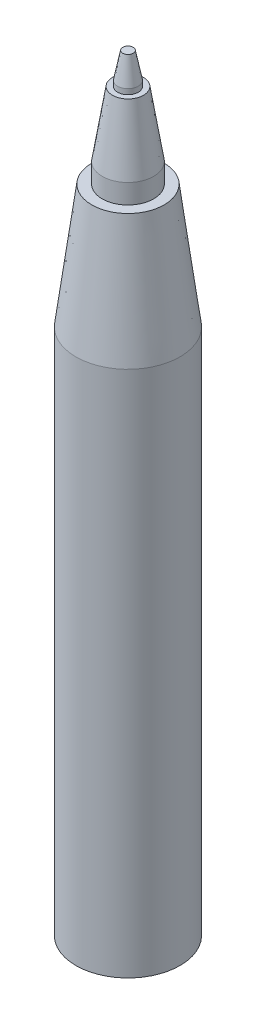
ISO-10303-21;
HEADER;
FILE_DESCRIPTION(('STEP AP214'),'2;1');
FILE_NAME('part.step','',(''),(''),'','','');
FILE_SCHEMA(('AUTOMOTIVE_DESIGN { 1 0 10303 214 1 1 1 1 }'));
ENDSEC;
DATA;
#1=APPLICATION_CONTEXT('core data for automotive mechanical design processes');
#2=APPLICATION_PROTOCOL_DEFINITION('international standard','automotive_design',2000,#1);
#3=PRODUCT_CONTEXT('',#1,'mechanical');
#4=PRODUCT('Part','Part','',(#3));
#5=PRODUCT_RELATED_PRODUCT_CATEGORY('part','',(#4));
#6=PRODUCT_DEFINITION_FORMATION('','',#4);
#7=PRODUCT_DEFINITION_CONTEXT('part definition',#1,'design');
#8=PRODUCT_DEFINITION('design','',#6,#7);
#9=PRODUCT_DEFINITION_SHAPE('','',#8);
#10=(LENGTH_UNIT() NAMED_UNIT(*) SI_UNIT(.MILLI.,.METRE.));
#11=(NAMED_UNIT(*) PLANE_ANGLE_UNIT() SI_UNIT($,.RADIAN.));
#12=(NAMED_UNIT(*) SI_UNIT($,.STERADIAN.) SOLID_ANGLE_UNIT());
#13=UNCERTAINTY_MEASURE_WITH_UNIT(LENGTH_MEASURE(1.E-05),#10,'distance_accuracy_value','');
#14=(GEOMETRIC_REPRESENTATION_CONTEXT(3) GLOBAL_UNCERTAINTY_ASSIGNED_CONTEXT((#13)) GLOBAL_UNIT_ASSIGNED_CONTEXT((#10,
#11,#12)) REPRESENTATION_CONTEXT('',''));
#15=CARTESIAN_POINT('',(0.,0.,0.));
#16=DIRECTION('',(0.,0.,1.));
#17=DIRECTION('',(1.,0.,0.));
#18=AXIS2_PLACEMENT_3D('',#15,#16,#17);
#19=CARTESIAN_POINT('',(0.,0.,0.));
#20=DIRECTION('',(0.,1.,0.));
#21=DIRECTION('',(0.,0.,1.));
#22=AXIS2_PLACEMENT_3D('',#19,#20,#21);
#23=PLANE('',#22);
#24=CARTESIAN_POINT('',(0.,0.,0.));
#25=DIRECTION('',(0.,1.,0.));
#26=DIRECTION('',(0.,0.,1.));
#27=AXIS2_PLACEMENT_3D('',#24,#25,#26);
#28=CIRCLE('',#27,4.);
#29=CARTESIAN_POINT('',(0.,0.,4.));
#30=VERTEX_POINT('',#29);
#31=EDGE_CURVE('E10',#30,#30,#28,.T.);
#32=ORIENTED_EDGE('',*,*,#31,.F.);
#33=EDGE_LOOP('',(#32));
#34=FACE_BOUND('',#33,.T.);
#35=ADVANCED_FACE('F34',(#34),#23,.F.);
#36=CARTESIAN_POINT('',(0.,0.839345578277775,0.));
#37=DIRECTION('',(0.,1.,0.));
#38=DIRECTION('',(0.,0.,1.));
#39=AXIS2_PLACEMENT_3D('',#36,#37,#38);
#40=CYLINDRICAL_SURFACE('',#39,4.);
#41=CARTESIAN_POINT('',(0.,40.5,0.));
#42=DIRECTION('',(0.,1.,0.));
#43=DIRECTION('',(0.,0.,1.));
#44=AXIS2_PLACEMENT_3D('',#41,#42,#43);
#45=CIRCLE('',#44,4.);
#46=CARTESIAN_POINT('',(0.,40.5,4.));
#47=VERTEX_POINT('',#46);
#48=EDGE_CURVE('E40',#47,#47,#45,.T.);
#49=ORIENTED_EDGE('',*,*,#48,.F.);
#50=EDGE_LOOP('',(#49));
#51=FACE_BOUND('',#50,.T.);
#52=ORIENTED_EDGE('',*,*,#31,.T.);
#53=EDGE_LOOP('',(#52));
#54=FACE_BOUND('',#53,.T.);
#55=ADVANCED_FACE('F109',(#51,#54),#40,.T.);
#56=CARTESIAN_POINT('',(0.,40.5,0.));
#57=DIRECTION('',(0.,-1.,0.));
#58=DIRECTION('',(0.,0.,-1.));
#59=AXIS2_PLACEMENT_3D('',#56,#57,#58);
#60=CONICAL_SURFACE('',#59,4.,0.12791614658432);
#61=CARTESIAN_POINT('',(0.,50.,0.));
#62=DIRECTION('',(0.,1.,0.));
#63=DIRECTION('',(0.,0.,1.));
#64=AXIS2_PLACEMENT_3D('',#61,#62,#63);
#65=CIRCLE('',#64,2.77812499999999);
#66=CARTESIAN_POINT('',(0.,50.,2.77812499999999));
#67=VERTEX_POINT('',#66);
#68=EDGE_CURVE('E44',#67,#67,#65,.T.);
#69=ORIENTED_EDGE('',*,*,#68,.F.);
#70=EDGE_LOOP('',(#69));
#71=FACE_BOUND('',#70,.T.);
#72=ORIENTED_EDGE('',*,*,#48,.T.);
#73=EDGE_LOOP('',(#72));
#74=FACE_BOUND('',#73,.T.);
#75=ADVANCED_FACE('F104',(#71,#74),#60,.T.);
#76=CARTESIAN_POINT('',(2.77812499999999,50.,0.));
#77=DIRECTION('',(0.,-1.,0.));
#78=DIRECTION('',(0.,0.,-1.));
#79=AXIS2_PLACEMENT_3D('',#76,#77,#78);
#80=PLANE('',#79);
#81=CARTESIAN_POINT('',(0.,50.,0.));
#82=DIRECTION('',(0.,1.,0.));
#83=DIRECTION('',(0.,0.,1.));
#84=AXIS2_PLACEMENT_3D('',#81,#82,#83);
#85=CIRCLE('',#84,1.97812499999999);
#86=CARTESIAN_POINT('',(0.,50.,1.97812499999999));
#87=VERTEX_POINT('',#86);
#88=EDGE_CURVE('E48',#87,#87,#85,.T.);
#89=ORIENTED_EDGE('',*,*,#88,.F.);
#90=EDGE_LOOP('',(#89));
#91=FACE_BOUND('',#90,.T.);
#92=ORIENTED_EDGE('',*,*,#68,.T.);
#93=EDGE_LOOP('',(#92));
#94=FACE_BOUND('',#93,.T.);
#95=ADVANCED_FACE('F98',(#91,#94),#80,.F.);
#96=CARTESIAN_POINT('',(0.,0.839345578277775,0.));
#97=DIRECTION('',(0.,1.,0.));
#98=DIRECTION('',(0.,0.,1.));
#99=AXIS2_PLACEMENT_3D('',#96,#97,#98);
#100=CYLINDRICAL_SURFACE('',#99,1.97812499999999);
#101=CARTESIAN_POINT('',(0.,51.5,0.));
#102=DIRECTION('',(0.,1.,0.));
#103=DIRECTION('',(0.,0.,1.));
#104=AXIS2_PLACEMENT_3D('',#101,#102,#103);
#105=CIRCLE('',#104,1.97812499999999);
#106=CARTESIAN_POINT('',(0.,51.5,1.97812499999999));
#107=VERTEX_POINT('',#106);
#108=EDGE_CURVE('E53',#107,#107,#105,.T.);
#109=ORIENTED_EDGE('',*,*,#108,.F.);
#110=EDGE_LOOP('',(#109));
#111=FACE_BOUND('',#110,.T.);
#112=ORIENTED_EDGE('',*,*,#88,.T.);
#113=EDGE_LOOP('',(#112));
#114=FACE_BOUND('',#113,.T.);
#115=ADVANCED_FACE('F92',(#111,#114),#100,.T.);
#116=CARTESIAN_POINT('',(0.,51.5,0.));
#117=DIRECTION('',(0.,-1.,0.));
#118=DIRECTION('',(0.,0.,-1.));
#119=AXIS2_PLACEMENT_3D('',#116,#117,#118);
#120=CONICAL_SURFACE('',#119,1.97812499999999,0.156216718444122);
#121=CARTESIAN_POINT('',(0.,56.5,0.));
#122=DIRECTION('',(0.,1.,0.));
#123=DIRECTION('',(0.,0.,1.));
#124=AXIS2_PLACEMENT_3D('',#121,#122,#123);
#125=CIRCLE('',#124,1.19062499999999);
#126=CARTESIAN_POINT('',(0.,56.5,1.19062499999999));
#127=VERTEX_POINT('',#126);
#128=EDGE_CURVE('E56',#127,#127,#125,.T.);
#129=ORIENTED_EDGE('',*,*,#128,.F.);
#130=EDGE_LOOP('',(#129));
#131=FACE_BOUND('',#130,.T.);
#132=ORIENTED_EDGE('',*,*,#108,.T.);
#133=EDGE_LOOP('',(#132));
#134=FACE_BOUND('',#133,.T.);
#135=ADVANCED_FACE('F86',(#131,#134),#120,.T.);
#136=CARTESIAN_POINT('',(1.19062499999999,56.5,0.));
#137=DIRECTION('',(0.,-1.,0.));
#138=DIRECTION('',(0.,0.,-1.));
#139=AXIS2_PLACEMENT_3D('',#136,#137,#138);
#140=PLANE('',#139);
#141=CARTESIAN_POINT('',(0.,56.5,0.));
#142=DIRECTION('',(0.,1.,0.));
#143=DIRECTION('',(0.,0.,1.));
#144=AXIS2_PLACEMENT_3D('',#141,#142,#143);
#145=CIRCLE('',#144,0.790624999999993);
#146=CARTESIAN_POINT('',(0.,56.5,0.790624999999993));
#147=VERTEX_POINT('',#146);
#148=EDGE_CURVE('E59',#147,#147,#145,.T.);
#149=ORIENTED_EDGE('',*,*,#148,.F.);
#150=EDGE_LOOP('',(#149));
#151=FACE_BOUND('',#150,.T.);
#152=ORIENTED_EDGE('',*,*,#128,.T.);
#153=EDGE_LOOP('',(#152));
#154=FACE_BOUND('',#153,.T.);
#155=ADVANCED_FACE('F80',(#151,#154),#140,.F.);
#156=CARTESIAN_POINT('',(0.,0.839345578277775,0.));
#157=DIRECTION('',(0.,1.,0.));
#158=DIRECTION('',(0.,0.,1.));
#159=AXIS2_PLACEMENT_3D('',#156,#157,#158);
#160=CYLINDRICAL_SURFACE('',#159,0.790624999999993);
#161=CARTESIAN_POINT('',(0.,56.9,0.));
#162=DIRECTION('',(0.,1.,0.));
#163=DIRECTION('',(0.,0.,1.));
#164=AXIS2_PLACEMENT_3D('',#161,#162,#163);
#165=CIRCLE('',#164,0.790624999999993);
#166=CARTESIAN_POINT('',(0.,56.9,0.790624999999993));
#167=VERTEX_POINT('',#166);
#168=EDGE_CURVE('E62',#167,#167,#165,.T.);
#169=ORIENTED_EDGE('',*,*,#168,.F.);
#170=EDGE_LOOP('',(#169));
#171=FACE_BOUND('',#170,.T.);
#172=ORIENTED_EDGE('',*,*,#148,.T.);
#173=EDGE_LOOP('',(#172));
#174=FACE_BOUND('',#173,.T.);
#175=ADVANCED_FACE('F74',(#171,#174),#160,.T.);
#176=CARTESIAN_POINT('',(0.,56.9,0.));
#177=DIRECTION('',(0.,-1.,0.));
#178=DIRECTION('',(0.,0.,-1.));
#179=AXIS2_PLACEMENT_3D('',#176,#177,#178);
#180=CONICAL_SURFACE('',#179,0.790624999999993,0.192884312257975);
#181=CARTESIAN_POINT('',(0.,58.9,0.));
#182=DIRECTION('',(0.,1.,0.));
#183=DIRECTION('',(0.,0.,1.));
#184=AXIS2_PLACEMENT_3D('',#181,#182,#183);
#185=CIRCLE('',#184,0.399999999999993);
#186=CARTESIAN_POINT('',(0.,58.9,0.399999999999993));
#187=VERTEX_POINT('',#186);
#188=EDGE_CURVE('E65',#187,#187,#185,.T.);
#189=ORIENTED_EDGE('',*,*,#188,.F.);
#190=EDGE_LOOP('',(#189));
#191=FACE_BOUND('',#190,.T.);
#192=ORIENTED_EDGE('',*,*,#168,.T.);
#193=EDGE_LOOP('',(#192));
#194=FACE_BOUND('',#193,.T.);
#195=ADVANCED_FACE('F71',(#191,#194),#180,.T.);
#196=CARTESIAN_POINT('',(0.399999999999993,58.9,0.));
#197=DIRECTION('',(0.,-1.,0.));
#198=DIRECTION('',(0.,0.,-1.));
#199=AXIS2_PLACEMENT_3D('',#196,#197,#198);
#200=PLANE('',#199);
#201=ORIENTED_EDGE('',*,*,#188,.T.);
#202=EDGE_LOOP('',(#201));
#203=FACE_BOUND('',#202,.T.);
#204=ADVANCED_FACE('F69',(#203),#200,.F.);
#205=CLOSED_SHELL('',(#35,#55,#75,#95,#115,#135,#155,#175,#195,#204));
#206=MANIFOLD_SOLID_BREP('B2',#205);
#207=ADVANCED_BREP_SHAPE_REPRESENTATION('',(#18,#206),#14);
#208=SHAPE_DEFINITION_REPRESENTATION(#9,#207);
ENDSEC;
END-ISO-10303-21;
